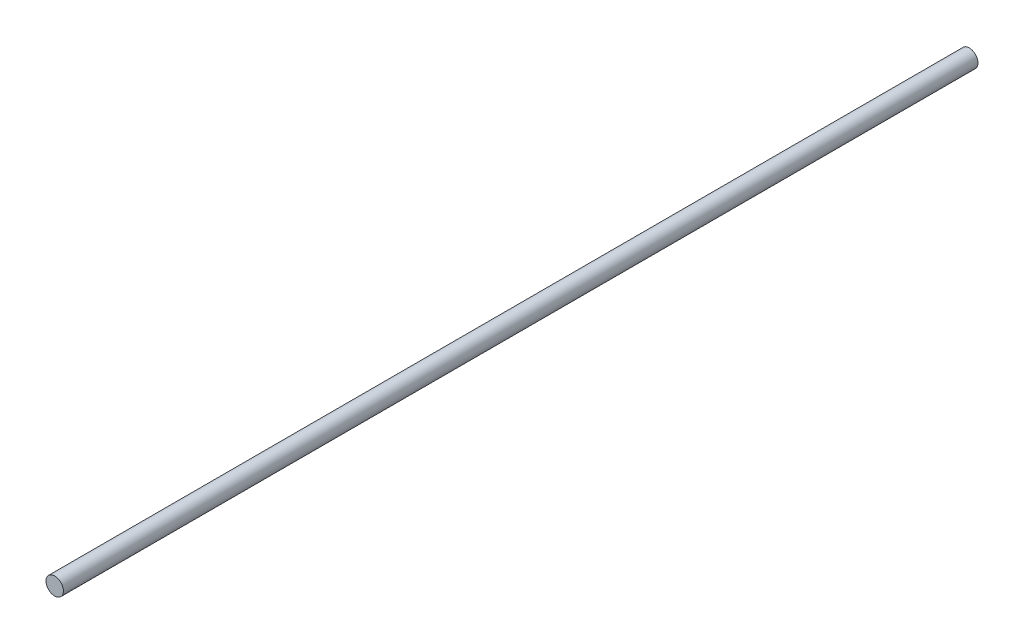
ISO-10303-21;
HEADER;
FILE_DESCRIPTION(('STEP AP214'),'2;1');
FILE_NAME('part.step','',(''),(''),'','','');
FILE_SCHEMA(('AUTOMOTIVE_DESIGN { 1 0 10303 214 1 1 1 1 }'));
ENDSEC;
DATA;
#1=APPLICATION_CONTEXT('core data for automotive mechanical design processes');
#2=APPLICATION_PROTOCOL_DEFINITION('international standard','automotive_design',2000,#1);
#3=PRODUCT_CONTEXT('',#1,'mechanical');
#4=PRODUCT('Part','Part','',(#3));
#5=PRODUCT_RELATED_PRODUCT_CATEGORY('part','',(#4));
#6=PRODUCT_DEFINITION_FORMATION('','',#4);
#7=PRODUCT_DEFINITION_CONTEXT('part definition',#1,'design');
#8=PRODUCT_DEFINITION('design','',#6,#7);
#9=PRODUCT_DEFINITION_SHAPE('','',#8);
#10=(LENGTH_UNIT() NAMED_UNIT(*) SI_UNIT(.MILLI.,.METRE.));
#11=(NAMED_UNIT(*) PLANE_ANGLE_UNIT() SI_UNIT($,.RADIAN.));
#12=(NAMED_UNIT(*) SI_UNIT($,.STERADIAN.) SOLID_ANGLE_UNIT());
#13=UNCERTAINTY_MEASURE_WITH_UNIT(LENGTH_MEASURE(1.E-05),#10,'distance_accuracy_value','');
#14=(GEOMETRIC_REPRESENTATION_CONTEXT(3) GLOBAL_UNCERTAINTY_ASSIGNED_CONTEXT((#13)) GLOBAL_UNIT_ASSIGNED_CONTEXT((#10,
#11,#12)) REPRESENTATION_CONTEXT('',''));
#15=CARTESIAN_POINT('',(0.,0.,0.));
#16=DIRECTION('',(0.,0.,1.));
#17=DIRECTION('',(1.,0.,0.));
#18=AXIS2_PLACEMENT_3D('',#15,#16,#17);
#19=CARTESIAN_POINT('',(0.,0.,210.));
#20=DIRECTION('',(0.,0.,-1.));
#21=DIRECTION('',(-1.,0.,0.));
#22=AXIS2_PLACEMENT_3D('',#19,#20,#21);
#23=CYLINDRICAL_SURFACE('',#22,2.);
#24=CARTESIAN_POINT('',(0.,0.,210.));
#25=DIRECTION('',(0.,0.,1.));
#26=DIRECTION('',(1.,0.,0.));
#27=AXIS2_PLACEMENT_3D('',#24,#25,#26);
#28=CIRCLE('',#27,2.);
#29=CARTESIAN_POINT('',(2.,0.,210.));
#30=VERTEX_POINT('',#29);
#31=EDGE_CURVE('E10',#30,#30,#28,.T.);
#32=ORIENTED_EDGE('',*,*,#31,.F.);
#33=EDGE_LOOP('',(#32));
#34=FACE_BOUND('',#33,.T.);
#35=CARTESIAN_POINT('',(0.,0.,0.));
#36=DIRECTION('',(0.,0.,1.));
#37=DIRECTION('',(1.,0.,0.));
#38=AXIS2_PLACEMENT_3D('',#35,#36,#37);
#39=CIRCLE('',#38,2.);
#40=CARTESIAN_POINT('',(2.,0.,0.));
#41=VERTEX_POINT('',#40);
#42=EDGE_CURVE('E40',#41,#41,#39,.T.);
#43=ORIENTED_EDGE('',*,*,#42,.T.);
#44=EDGE_LOOP('',(#43));
#45=FACE_BOUND('',#44,.T.);
#46=ADVANCED_FACE('F37',(#34,#45),#23,.T.);
#47=CARTESIAN_POINT('',(0.,0.,210.));
#48=DIRECTION('',(0.,0.,1.));
#49=DIRECTION('',(1.,0.,0.));
#50=AXIS2_PLACEMENT_3D('',#47,#48,#49);
#51=PLANE('',#50);
#52=ORIENTED_EDGE('',*,*,#31,.T.);
#53=EDGE_LOOP('',(#52));
#54=FACE_BOUND('',#53,.T.);
#55=ADVANCED_FACE('F54',(#54),#51,.T.);
#56=CARTESIAN_POINT('',(0.,0.,0.));
#57=DIRECTION('',(0.,0.,1.));
#58=DIRECTION('',(1.,0.,0.));
#59=AXIS2_PLACEMENT_3D('',#56,#57,#58);
#60=PLANE('',#59);
#61=ORIENTED_EDGE('',*,*,#42,.F.);
#62=EDGE_LOOP('',(#61));
#63=FACE_BOUND('',#62,.T.);
#64=ADVANCED_FACE('F52',(#63),#60,.F.);
#65=CLOSED_SHELL('',(#46,#55,#64));
#66=MANIFOLD_SOLID_BREP('B2',#65);
#67=ADVANCED_BREP_SHAPE_REPRESENTATION('',(#18,#66),#14);
#68=SHAPE_DEFINITION_REPRESENTATION(#9,#67);
ENDSEC;
END-ISO-10303-21;
